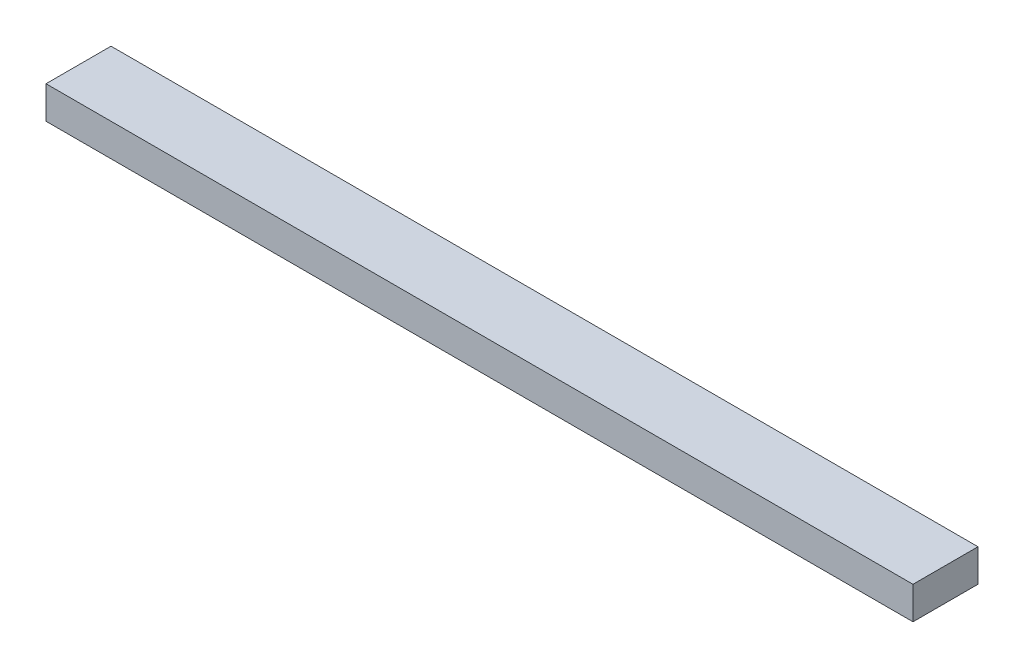
ISO-10303-21;
HEADER;
FILE_DESCRIPTION(('STEP AP214'),'2;1');
FILE_NAME('part.step','',(''),(''),'','','');
FILE_SCHEMA(('AUTOMOTIVE_DESIGN { 1 0 10303 214 1 1 1 1 }'));
ENDSEC;
DATA;
#1=APPLICATION_CONTEXT('core data for automotive mechanical design processes');
#2=APPLICATION_PROTOCOL_DEFINITION('international standard','automotive_design',2000,#1);
#3=PRODUCT_CONTEXT('',#1,'mechanical');
#4=PRODUCT('Part','Part','',(#3));
#5=PRODUCT_RELATED_PRODUCT_CATEGORY('part','',(#4));
#6=PRODUCT_DEFINITION_FORMATION('','',#4);
#7=PRODUCT_DEFINITION_CONTEXT('part definition',#1,'design');
#8=PRODUCT_DEFINITION('design','',#6,#7);
#9=PRODUCT_DEFINITION_SHAPE('','',#8);
#10=(LENGTH_UNIT() NAMED_UNIT(*) SI_UNIT(.MILLI.,.METRE.));
#11=(NAMED_UNIT(*) PLANE_ANGLE_UNIT() SI_UNIT($,.RADIAN.));
#12=(NAMED_UNIT(*) SI_UNIT($,.STERADIAN.) SOLID_ANGLE_UNIT());
#13=UNCERTAINTY_MEASURE_WITH_UNIT(LENGTH_MEASURE(1.E-05),#10,'distance_accuracy_value','');
#14=(GEOMETRIC_REPRESENTATION_CONTEXT(3) GLOBAL_UNCERTAINTY_ASSIGNED_CONTEXT((#13)) GLOBAL_UNIT_ASSIGNED_CONTEXT((#10,
#11,#12)) REPRESENTATION_CONTEXT('',''));
#15=CARTESIAN_POINT('',(0.,0.,0.));
#16=DIRECTION('',(0.,0.,1.));
#17=DIRECTION('',(1.,0.,0.));
#18=AXIS2_PLACEMENT_3D('',#15,#16,#17);
#19=CARTESIAN_POINT('',(-80.,6.,-5.99999999999999));
#20=DIRECTION('',(1.,0.,0.));
#21=DIRECTION('',(0.,0.,-1.));
#22=AXIS2_PLACEMENT_3D('',#19,#20,#21);
#23=PLANE('',#22);
#24=DIRECTION('',(0.,0.,1.));
#25=VECTOR('',#24,1.);
#26=CARTESIAN_POINT('',(-80.,0.,-5.99999999999999));
#27=LINE('',#26,#25);
#28=CARTESIAN_POINT('',(-80.,0.,-5.99999999999999));
#29=VERTEX_POINT('',#28);
#30=CARTESIAN_POINT('',(-80.,0.,6.00000000000001));
#31=VERTEX_POINT('',#30);
#32=EDGE_CURVE('E96',#29,#31,#27,.T.);
#33=ORIENTED_EDGE('',*,*,#32,.T.);
#34=DIRECTION('',(0.,-1.,0.));
#35=VECTOR('',#34,1.);
#36=CARTESIAN_POINT('',(-80.,6.,6.00000000000001));
#37=LINE('',#36,#35);
#38=CARTESIAN_POINT('',(-80.,6.,6.00000000000001));
#39=VERTEX_POINT('',#38);
#40=EDGE_CURVE('E11',#39,#31,#37,.T.);
#41=ORIENTED_EDGE('',*,*,#40,.F.);
#42=DIRECTION('',(0.,0.,1.));
#43=VECTOR('',#42,1.);
#44=CARTESIAN_POINT('',(-80.,6.,-5.99999999999999));
#45=LINE('',#44,#43);
#46=CARTESIAN_POINT('',(-80.,6.,-5.99999999999999));
#47=VERTEX_POINT('',#46);
#48=EDGE_CURVE('E84',#47,#39,#45,.T.);
#49=ORIENTED_EDGE('',*,*,#48,.F.);
#50=DIRECTION('',(0.,-1.,0.));
#51=VECTOR('',#50,1.);
#52=CARTESIAN_POINT('',(-80.,6.,-5.99999999999999));
#53=LINE('',#52,#51);
#54=EDGE_CURVE('E92',#47,#29,#53,.T.);
#55=ORIENTED_EDGE('',*,*,#54,.T.);
#56=EDGE_LOOP('',(#33,#41,#49,#55));
#57=FACE_BOUND('',#56,.T.);
#58=ADVANCED_FACE('F33',(#57),#23,.F.);
#59=CARTESIAN_POINT('',(80.,6.,5.99999999999999));
#60=DIRECTION('',(0.,0.,-1.));
#61=DIRECTION('',(-1.,0.,0.));
#62=AXIS2_PLACEMENT_3D('',#59,#60,#61);
#63=PLANE('',#62);
#64=DIRECTION('',(1.,0.,0.));
#65=VECTOR('',#64,1.);
#66=CARTESIAN_POINT('',(80.,0.,5.99999999999999));
#67=LINE('',#66,#65);
#68=CARTESIAN_POINT('',(80.,0.,5.99999999999999));
#69=VERTEX_POINT('',#68);
#70=EDGE_CURVE('E88',#31,#69,#67,.T.);
#71=ORIENTED_EDGE('',*,*,#70,.T.);
#72=DIRECTION('',(0.,-1.,0.));
#73=VECTOR('',#72,1.);
#74=CARTESIAN_POINT('',(80.,6.,5.99999999999999));
#75=LINE('',#74,#73);
#76=CARTESIAN_POINT('',(80.,6.,5.99999999999999));
#77=VERTEX_POINT('',#76);
#78=EDGE_CURVE('E41',#77,#69,#75,.T.);
#79=ORIENTED_EDGE('',*,*,#78,.F.);
#80=DIRECTION('',(1.,0.,0.));
#81=VECTOR('',#80,1.);
#82=CARTESIAN_POINT('',(80.,6.,5.99999999999999));
#83=LINE('',#82,#81);
#84=EDGE_CURVE('E79',#39,#77,#83,.T.);
#85=ORIENTED_EDGE('',*,*,#84,.F.);
#86=ORIENTED_EDGE('',*,*,#40,.T.);
#87=EDGE_LOOP('',(#71,#79,#85,#86));
#88=FACE_BOUND('',#87,.T.);
#89=ADVANCED_FACE('F87',(#88),#63,.F.);
#90=CARTESIAN_POINT('',(80.,6.,-6.00000000000001));
#91=DIRECTION('',(-1.,0.,0.));
#92=DIRECTION('',(0.,0.,1.));
#93=AXIS2_PLACEMENT_3D('',#90,#91,#92);
#94=PLANE('',#93);
#95=DIRECTION('',(0.,0.,-1.));
#96=VECTOR('',#95,1.);
#97=CARTESIAN_POINT('',(80.,0.,-6.00000000000001));
#98=LINE('',#97,#96);
#99=CARTESIAN_POINT('',(80.,0.,-6.00000000000001));
#100=VERTEX_POINT('',#99);
#101=EDGE_CURVE('E66',#69,#100,#98,.T.);
#102=ORIENTED_EDGE('',*,*,#101,.T.);
#103=DIRECTION('',(0.,-1.,0.));
#104=VECTOR('',#103,1.);
#105=CARTESIAN_POINT('',(80.,6.,-6.00000000000001));
#106=LINE('',#105,#104);
#107=CARTESIAN_POINT('',(80.,6.,-6.00000000000001));
#108=VERTEX_POINT('',#107);
#109=EDGE_CURVE('E89',#108,#100,#106,.T.);
#110=ORIENTED_EDGE('',*,*,#109,.F.);
#111=DIRECTION('',(0.,0.,-1.));
#112=VECTOR('',#111,1.);
#113=CARTESIAN_POINT('',(80.,6.,-6.00000000000001));
#114=LINE('',#113,#112);
#115=EDGE_CURVE('E82',#77,#108,#114,.T.);
#116=ORIENTED_EDGE('',*,*,#115,.F.);
#117=ORIENTED_EDGE('',*,*,#78,.T.);
#118=EDGE_LOOP('',(#102,#110,#116,#117));
#119=FACE_BOUND('',#118,.T.);
#120=ADVANCED_FACE('F90',(#119),#94,.F.);
#121=CARTESIAN_POINT('',(80.,6.,-6.00000000000001));
#122=DIRECTION('',(0.,0.,1.));
#123=DIRECTION('',(1.,0.,0.));
#124=AXIS2_PLACEMENT_3D('',#121,#122,#123);
#125=PLANE('',#124);
#126=DIRECTION('',(-1.,0.,0.));
#127=VECTOR('',#126,1.);
#128=CARTESIAN_POINT('',(80.,0.,-6.00000000000001));
#129=LINE('',#128,#127);
#130=EDGE_CURVE('E72',#100,#29,#129,.T.);
#131=ORIENTED_EDGE('',*,*,#130,.T.);
#132=ORIENTED_EDGE('',*,*,#54,.F.);
#133=DIRECTION('',(-1.,0.,0.));
#134=VECTOR('',#133,1.);
#135=CARTESIAN_POINT('',(80.,6.,-6.00000000000001));
#136=LINE('',#135,#134);
#137=EDGE_CURVE('E49',#108,#47,#136,.T.);
#138=ORIENTED_EDGE('',*,*,#137,.F.);
#139=ORIENTED_EDGE('',*,*,#109,.T.);
#140=EDGE_LOOP('',(#131,#132,#138,#139));
#141=FACE_BOUND('',#140,.T.);
#142=ADVANCED_FACE('F103',(#141),#125,.F.);
#143=CARTESIAN_POINT('',(0.,6.,0.));
#144=DIRECTION('',(0.,-1.,0.));
#145=DIRECTION('',(0.,0.,-1.));
#146=AXIS2_PLACEMENT_3D('',#143,#144,#145);
#147=PLANE('',#146);
#148=ORIENTED_EDGE('',*,*,#48,.T.);
#149=ORIENTED_EDGE('',*,*,#84,.T.);
#150=ORIENTED_EDGE('',*,*,#115,.T.);
#151=ORIENTED_EDGE('',*,*,#137,.T.);
#152=EDGE_LOOP('',(#148,#149,#150,#151));
#153=FACE_BOUND('',#152,.T.);
#154=ADVANCED_FACE('F80',(#153),#147,.F.);
#155=CARTESIAN_POINT('',(0.,0.,0.));
#156=DIRECTION('',(0.,-1.,0.));
#157=DIRECTION('',(0.,0.,-1.));
#158=AXIS2_PLACEMENT_3D('',#155,#156,#157);
#159=PLANE('',#158);
#160=ORIENTED_EDGE('',*,*,#32,.F.);
#161=ORIENTED_EDGE('',*,*,#130,.F.);
#162=ORIENTED_EDGE('',*,*,#101,.F.);
#163=ORIENTED_EDGE('',*,*,#70,.F.);
#164=EDGE_LOOP('',(#160,#161,#162,#163));
#165=FACE_BOUND('',#164,.T.);
#166=ADVANCED_FACE('F106',(#165),#159,.T.);
#167=CLOSED_SHELL('',(#58,#89,#120,#142,#154,#166));
#168=MANIFOLD_SOLID_BREP('B2',#167);
#169=ADVANCED_BREP_SHAPE_REPRESENTATION('',(#18,#168),#14);
#170=SHAPE_DEFINITION_REPRESENTATION(#9,#169);
ENDSEC;
END-ISO-10303-21;
